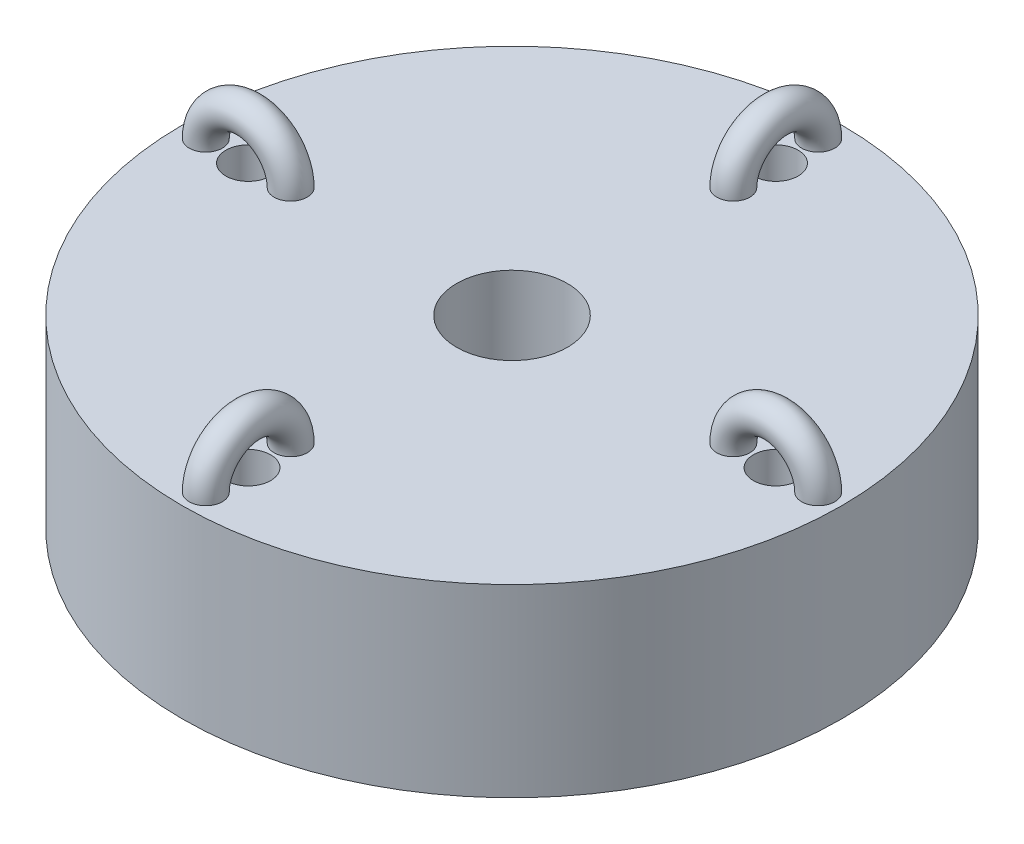
ISO-10303-21;
HEADER;
FILE_DESCRIPTION(('STEP AP214'),'2;1');
FILE_NAME('part.step','',(''),(''),'','','');
FILE_SCHEMA(('AUTOMOTIVE_DESIGN { 1 0 10303 214 1 1 1 1 }'));
ENDSEC;
DATA;
#1=APPLICATION_CONTEXT('core data for automotive mechanical design processes');
#2=APPLICATION_PROTOCOL_DEFINITION('international standard','automotive_design',2000,#1);
#3=PRODUCT_CONTEXT('',#1,'mechanical');
#4=PRODUCT('Part','Part','',(#3));
#5=PRODUCT_RELATED_PRODUCT_CATEGORY('part','',(#4));
#6=PRODUCT_DEFINITION_FORMATION('','',#4);
#7=PRODUCT_DEFINITION_CONTEXT('part definition',#1,'design');
#8=PRODUCT_DEFINITION('design','',#6,#7);
#9=PRODUCT_DEFINITION_SHAPE('','',#8);
#10=(LENGTH_UNIT() NAMED_UNIT(*) SI_UNIT(.MILLI.,.METRE.));
#11=(NAMED_UNIT(*) PLANE_ANGLE_UNIT() SI_UNIT($,.RADIAN.));
#12=(NAMED_UNIT(*) SI_UNIT($,.STERADIAN.) SOLID_ANGLE_UNIT());
#13=UNCERTAINTY_MEASURE_WITH_UNIT(LENGTH_MEASURE(1.E-05),#10,'distance_accuracy_value','');
#14=(GEOMETRIC_REPRESENTATION_CONTEXT(3) GLOBAL_UNCERTAINTY_ASSIGNED_CONTEXT((#13)) GLOBAL_UNIT_ASSIGNED_CONTEXT((#10,
#11,#12)) REPRESENTATION_CONTEXT('',''));
#15=CARTESIAN_POINT('',(0.,0.,0.));
#16=DIRECTION('',(0.,0.,1.));
#17=DIRECTION('',(1.,0.,0.));
#18=AXIS2_PLACEMENT_3D('',#15,#16,#17);
#19=CARTESIAN_POINT('',(0.,7.,0.));
#20=DIRECTION('',(0.,-1.,0.));
#21=DIRECTION('',(0.,0.,-1.));
#22=AXIS2_PLACEMENT_3D('',#19,#20,#21);
#23=CYLINDRICAL_SURFACE('',#22,1.);
#24=CARTESIAN_POINT('',(0.,0.,0.));
#25=DIRECTION('',(0.,1.,0.));
#26=DIRECTION('',(0.,0.,1.));
#27=AXIS2_PLACEMENT_3D('',#24,#25,#26);
#28=CIRCLE('',#27,1.);
#29=CARTESIAN_POINT('',(0.,0.,1.));
#30=VERTEX_POINT('',#29);
#31=EDGE_CURVE('E73',#30,#30,#28,.T.);
#32=ORIENTED_EDGE('',*,*,#31,.F.);
#33=EDGE_LOOP('',(#32));
#34=FACE_BOUND('',#33,.T.);
#35=CARTESIAN_POINT('',(0.,3.,0.));
#36=DIRECTION('',(0.,1.,0.));
#37=DIRECTION('',(0.,0.,1.));
#38=AXIS2_PLACEMENT_3D('',#35,#36,#37);
#39=CIRCLE('',#38,1.);
#40=CARTESIAN_POINT('',(0.,3.,1.));
#41=VERTEX_POINT('',#40);
#42=EDGE_CURVE('E41',#41,#41,#39,.T.);
#43=ORIENTED_EDGE('',*,*,#42,.T.);
#44=EDGE_LOOP('',(#43));
#45=FACE_BOUND('',#44,.T.);
#46=ADVANCED_FACE('F37',(#34,#45),#23,.F.);
#47=CARTESIAN_POINT('',(0.,7.,0.));
#48=DIRECTION('',(0.,1.,0.));
#49=DIRECTION('',(0.,0.,1.));
#50=AXIS2_PLACEMENT_3D('',#47,#48,#49);
#51=PLANE('',#50);
#52=CARTESIAN_POINT('',(0.,7.,0.));
#53=DIRECTION('',(0.,1.,0.));
#54=DIRECTION('',(0.,0.,1.));
#55=AXIS2_PLACEMENT_3D('',#52,#53,#54);
#56=CIRCLE('',#55,2.1);
#57=CARTESIAN_POINT('',(0.,7.,2.1));
#58=VERTEX_POINT('',#57);
#59=EDGE_CURVE('E102',#58,#58,#56,.T.);
#60=ORIENTED_EDGE('',*,*,#59,.F.);
#61=EDGE_LOOP('',(#60));
#62=FACE_BOUND('',#61,.T.);
#63=CARTESIAN_POINT('',(-1.21599318248256E-13,7.,11.6091429823258));
#64=DIRECTION('',(0.,1.,0.));
#65=DIRECTION('',(0.,0.,1.));
#66=AXIS2_PLACEMENT_3D('',#63,#64,#65);
#67=CIRCLE('',#66,0.629258672823457);
#68=CARTESIAN_POINT('',(-1.28190452988661E-13,7.,12.2384016551492));
#69=VERTEX_POINT('',#68);
#70=EDGE_CURVE('E10',#69,#69,#67,.T.);
#71=ORIENTED_EDGE('',*,*,#70,.F.);
#72=EDGE_LOOP('',(#71));
#73=FACE_BOUND('',#72,.T.);
#74=CARTESIAN_POINT('',(0.,7.,8.39085701767423));
#75=DIRECTION('',(0.,1.,0.));
#76=DIRECTION('',(0.,0.,1.));
#77=AXIS2_PLACEMENT_3D('',#74,#75,#76);
#78=CIRCLE('',#77,0.629258672823457);
#79=CARTESIAN_POINT('',(0.,7.,7.76159834485077));
#80=VERTEX_POINT('',#79);
#81=EDGE_CURVE('E45',#80,#80,#78,.T.);
#82=ORIENTED_EDGE('',*,*,#81,.F.);
#83=EDGE_LOOP('',(#82));
#84=FACE_BOUND('',#83,.T.);
#85=CARTESIAN_POINT('',(11.6091429823258,7.,0.));
#86=DIRECTION('',(0.,1.,0.));
#87=DIRECTION('',(0.,0.,1.));
#88=AXIS2_PLACEMENT_3D('',#85,#86,#87);
#89=CIRCLE('',#88,0.629258672823457);
#90=CARTESIAN_POINT('',(12.2384016551492,7.,0.));
#91=VERTEX_POINT('',#90);
#92=EDGE_CURVE('E49',#91,#91,#89,.T.);
#93=ORIENTED_EDGE('',*,*,#92,.F.);
#94=EDGE_LOOP('',(#93));
#95=FACE_BOUND('',#94,.T.);
#96=CARTESIAN_POINT('',(8.39085701767423,7.,0.));
#97=DIRECTION('',(0.,1.,0.));
#98=DIRECTION('',(0.,0.,1.));
#99=AXIS2_PLACEMENT_3D('',#96,#97,#98);
#100=CIRCLE('',#99,0.629258672823457);
#101=CARTESIAN_POINT('',(7.76159834485077,7.,0.));
#102=VERTEX_POINT('',#101);
#103=EDGE_CURVE('E54',#102,#102,#100,.T.);
#104=ORIENTED_EDGE('',*,*,#103,.F.);
#105=EDGE_LOOP('',(#104));
#106=FACE_BOUND('',#105,.T.);
#107=CARTESIAN_POINT('',(0.,7.,-11.6091429823258));
#108=DIRECTION('',(0.,1.,0.));
#109=DIRECTION('',(0.,0.,1.));
#110=AXIS2_PLACEMENT_3D('',#107,#108,#109);
#111=CIRCLE('',#110,0.629258672823457);
#112=CARTESIAN_POINT('',(0.,7.,-12.2384016551492));
#113=VERTEX_POINT('',#112);
#114=EDGE_CURVE('E57',#113,#113,#111,.T.);
#115=ORIENTED_EDGE('',*,*,#114,.F.);
#116=EDGE_LOOP('',(#115));
#117=FACE_BOUND('',#116,.T.);
#118=CARTESIAN_POINT('',(0.,7.,-8.39085701767423));
#119=DIRECTION('',(0.,1.,0.));
#120=DIRECTION('',(0.,0.,1.));
#121=AXIS2_PLACEMENT_3D('',#118,#119,#120);
#122=CIRCLE('',#121,0.629258672823457);
#123=CARTESIAN_POINT('',(0.,7.,-7.76159834485077));
#124=VERTEX_POINT('',#123);
#125=EDGE_CURVE('E60',#124,#124,#122,.T.);
#126=ORIENTED_EDGE('',*,*,#125,.F.);
#127=EDGE_LOOP('',(#126));
#128=FACE_BOUND('',#127,.T.);
#129=CARTESIAN_POINT('',(-11.6091429823258,7.,0.));
#130=DIRECTION('',(0.,1.,0.));
#131=DIRECTION('',(0.,0.,1.));
#132=AXIS2_PLACEMENT_3D('',#129,#130,#131);
#133=CIRCLE('',#132,0.629258672823457);
#134=CARTESIAN_POINT('',(-12.2384016551492,7.,0.));
#135=VERTEX_POINT('',#134);
#136=EDGE_CURVE('E63',#135,#135,#133,.T.);
#137=ORIENTED_EDGE('',*,*,#136,.F.);
#138=EDGE_LOOP('',(#137));
#139=FACE_BOUND('',#138,.T.);
#140=CARTESIAN_POINT('',(-8.39085701767423,7.,0.));
#141=DIRECTION('',(0.,1.,0.));
#142=DIRECTION('',(0.,0.,1.));
#143=AXIS2_PLACEMENT_3D('',#140,#141,#142);
#144=CIRCLE('',#143,0.629258672823457);
#145=CARTESIAN_POINT('',(-7.76159834485077,7.,0.));
#146=VERTEX_POINT('',#145);
#147=EDGE_CURVE('E66',#146,#146,#144,.T.);
#148=ORIENTED_EDGE('',*,*,#147,.F.);
#149=EDGE_LOOP('',(#148));
#150=FACE_BOUND('',#149,.T.);
#151=CARTESIAN_POINT('',(0.,7.,10.));
#152=DIRECTION('',(0.,1.,0.));
#153=DIRECTION('',(0.,0.,1.));
#154=AXIS2_PLACEMENT_3D('',#151,#152,#153);
#155=CIRCLE('',#154,0.85);
#156=CARTESIAN_POINT('',(0.,7.,10.85));
#157=VERTEX_POINT('',#156);
#158=EDGE_CURVE('E88',#157,#157,#155,.T.);
#159=ORIENTED_EDGE('',*,*,#158,.F.);
#160=EDGE_LOOP('',(#159));
#161=FACE_BOUND('',#160,.T.);
#162=CARTESIAN_POINT('',(0.,7.,-10.));
#163=DIRECTION('',(0.,1.,0.));
#164=DIRECTION('',(0.,0.,1.));
#165=AXIS2_PLACEMENT_3D('',#162,#163,#164);
#166=CIRCLE('',#165,0.85);
#167=CARTESIAN_POINT('',(0.,7.,-9.15));
#168=VERTEX_POINT('',#167);
#169=EDGE_CURVE('E78',#168,#168,#166,.T.);
#170=ORIENTED_EDGE('',*,*,#169,.F.);
#171=EDGE_LOOP('',(#170));
#172=FACE_BOUND('',#171,.T.);
#173=CARTESIAN_POINT('',(0.,7.,0.));
#174=DIRECTION('',(0.,1.,0.));
#175=DIRECTION('',(0.,0.,1.));
#176=AXIS2_PLACEMENT_3D('',#173,#174,#175);
#177=CIRCLE('',#176,12.5);
#178=CARTESIAN_POINT('',(0.,7.,12.5));
#179=VERTEX_POINT('',#178);
#180=EDGE_CURVE('E69',#179,#179,#177,.T.);
#181=ORIENTED_EDGE('',*,*,#180,.T.);
#182=EDGE_LOOP('',(#181));
#183=FACE_BOUND('',#182,.T.);
#184=CARTESIAN_POINT('',(10.,7.,0.));
#185=DIRECTION('',(0.,1.,0.));
#186=DIRECTION('',(0.,0.,1.));
#187=AXIS2_PLACEMENT_3D('',#184,#185,#186);
#188=CIRCLE('',#187,0.85);
#189=CARTESIAN_POINT('',(10.,7.,0.849999999999999));
#190=VERTEX_POINT('',#189);
#191=EDGE_CURVE('E82',#190,#190,#188,.T.);
#192=ORIENTED_EDGE('',*,*,#191,.F.);
#193=EDGE_LOOP('',(#192));
#194=FACE_BOUND('',#193,.T.);
#195=CARTESIAN_POINT('',(-10.,7.,0.));
#196=DIRECTION('',(0.,1.,0.));
#197=DIRECTION('',(0.,0.,1.));
#198=AXIS2_PLACEMENT_3D('',#195,#196,#197);
#199=CIRCLE('',#198,0.85);
#200=CARTESIAN_POINT('',(-10.,7.,0.850000000000002));
#201=VERTEX_POINT('',#200);
#202=EDGE_CURVE('E94',#201,#201,#199,.T.);
#203=ORIENTED_EDGE('',*,*,#202,.F.);
#204=EDGE_LOOP('',(#203));
#205=FACE_BOUND('',#204,.T.);
#206=ADVANCED_FACE('F124',(#62,#73,#84,#95,#106,#117,#128,#139,#150,#161,#172,#183,#194,#205),
#51,.T.);
#207=CARTESIAN_POINT('',(0.,0.,0.));
#208=DIRECTION('',(0.,1.,0.));
#209=DIRECTION('',(0.,0.,1.));
#210=AXIS2_PLACEMENT_3D('',#207,#208,#209);
#211=PLANE('',#210);
#212=CARTESIAN_POINT('',(0.,0.,0.));
#213=DIRECTION('',(0.,1.,0.));
#214=DIRECTION('',(0.,0.,1.));
#215=AXIS2_PLACEMENT_3D('',#212,#213,#214);
#216=CIRCLE('',#215,12.5);
#217=CARTESIAN_POINT('',(0.,0.,12.5));
#218=VERTEX_POINT('',#217);
#219=EDGE_CURVE('E70',#218,#218,#216,.T.);
#220=ORIENTED_EDGE('',*,*,#219,.F.);
#221=EDGE_LOOP('',(#220));
#222=FACE_BOUND('',#221,.T.);
#223=ORIENTED_EDGE('',*,*,#31,.T.);
#224=EDGE_LOOP('',(#223));
#225=FACE_BOUND('',#224,.T.);
#226=CARTESIAN_POINT('',(0.,0.,-10.));
#227=DIRECTION('',(0.,1.,0.));
#228=DIRECTION('',(0.,0.,1.));
#229=AXIS2_PLACEMENT_3D('',#226,#227,#228);
#230=CIRCLE('',#229,0.85);
#231=CARTESIAN_POINT('',(0.,0.,-9.15));
#232=VERTEX_POINT('',#231);
#233=EDGE_CURVE('E79',#232,#232,#230,.T.);
#234=ORIENTED_EDGE('',*,*,#233,.T.);
#235=EDGE_LOOP('',(#234));
#236=FACE_BOUND('',#235,.T.);
#237=CARTESIAN_POINT('',(10.,0.,0.));
#238=DIRECTION('',(0.,1.,0.));
#239=DIRECTION('',(0.,0.,1.));
#240=AXIS2_PLACEMENT_3D('',#237,#238,#239);
#241=CIRCLE('',#240,0.85);
#242=CARTESIAN_POINT('',(10.,0.,0.849999999999999));
#243=VERTEX_POINT('',#242);
#244=EDGE_CURVE('E85',#243,#243,#241,.T.);
#245=ORIENTED_EDGE('',*,*,#244,.T.);
#246=EDGE_LOOP('',(#245));
#247=FACE_BOUND('',#246,.T.);
#248=CARTESIAN_POINT('',(0.,0.,10.));
#249=DIRECTION('',(0.,1.,0.));
#250=DIRECTION('',(0.,0.,1.));
#251=AXIS2_PLACEMENT_3D('',#248,#249,#250);
#252=CIRCLE('',#251,0.85);
#253=CARTESIAN_POINT('',(0.,0.,10.85));
#254=VERTEX_POINT('',#253);
#255=EDGE_CURVE('E91',#254,#254,#252,.T.);
#256=ORIENTED_EDGE('',*,*,#255,.T.);
#257=EDGE_LOOP('',(#256));
#258=FACE_BOUND('',#257,.T.);
#259=CARTESIAN_POINT('',(-10.,0.,0.));
#260=DIRECTION('',(0.,1.,0.));
#261=DIRECTION('',(0.,0.,1.));
#262=AXIS2_PLACEMENT_3D('',#259,#260,#261);
#263=CIRCLE('',#262,0.85);
#264=CARTESIAN_POINT('',(-10.,0.,0.850000000000002));
#265=VERTEX_POINT('',#264);
#266=EDGE_CURVE('E97',#265,#265,#263,.T.);
#267=ORIENTED_EDGE('',*,*,#266,.T.);
#268=EDGE_LOOP('',(#267));
#269=FACE_BOUND('',#268,.T.);
#270=ADVANCED_FACE('F130',(#222,#225,#236,#247,#258,#269),#211,.F.);
#271=CARTESIAN_POINT('',(0.,7.,0.));
#272=DIRECTION('',(0.,-1.,0.));
#273=DIRECTION('',(0.,0.,-1.));
#274=AXIS2_PLACEMENT_3D('',#271,#272,#273);
#275=CYLINDRICAL_SURFACE('',#274,12.5);
#276=ORIENTED_EDGE('',*,*,#180,.F.);
#277=EDGE_LOOP('',(#276));
#278=FACE_BOUND('',#277,.T.);
#279=ORIENTED_EDGE('',*,*,#219,.T.);
#280=EDGE_LOOP('',(#279));
#281=FACE_BOUND('',#280,.T.);
#282=ADVANCED_FACE('F39',(#278,#281),#275,.T.);
#283=CARTESIAN_POINT('',(0.,7.,-10.));
#284=DIRECTION('',(0.,-1.,0.));
#285=DIRECTION('',(0.,0.,-1.));
#286=AXIS2_PLACEMENT_3D('',#283,#284,#285);
#287=CYLINDRICAL_SURFACE('',#286,0.85);
#288=ORIENTED_EDGE('',*,*,#169,.T.);
#289=EDGE_LOOP('',(#288));
#290=FACE_BOUND('',#289,.T.);
#291=ORIENTED_EDGE('',*,*,#233,.F.);
#292=EDGE_LOOP('',(#291));
#293=FACE_BOUND('',#292,.T.);
#294=ADVANCED_FACE('F135',(#290,#293),#287,.F.);
#295=CARTESIAN_POINT('',(10.,7.,0.));
#296=DIRECTION('',(0.,-1.,0.));
#297=DIRECTION('',(0.,0.,-1.));
#298=AXIS2_PLACEMENT_3D('',#295,#296,#297);
#299=CYLINDRICAL_SURFACE('',#298,0.85);
#300=ORIENTED_EDGE('',*,*,#191,.T.);
#301=EDGE_LOOP('',(#300));
#302=FACE_BOUND('',#301,.T.);
#303=ORIENTED_EDGE('',*,*,#244,.F.);
#304=EDGE_LOOP('',(#303));
#305=FACE_BOUND('',#304,.T.);
#306=ADVANCED_FACE('F167',(#302,#305),#299,.F.);
#307=CARTESIAN_POINT('',(0.,7.,10.));
#308=DIRECTION('',(0.,-1.,0.));
#309=DIRECTION('',(0.,0.,-1.));
#310=AXIS2_PLACEMENT_3D('',#307,#308,#309);
#311=CYLINDRICAL_SURFACE('',#310,0.85);
#312=ORIENTED_EDGE('',*,*,#158,.T.);
#313=EDGE_LOOP('',(#312));
#314=FACE_BOUND('',#313,.T.);
#315=ORIENTED_EDGE('',*,*,#255,.F.);
#316=EDGE_LOOP('',(#315));
#317=FACE_BOUND('',#316,.T.);
#318=ADVANCED_FACE('F157',(#314,#317),#311,.F.);
#319=CARTESIAN_POINT('',(-10.,7.,0.));
#320=DIRECTION('',(0.,-1.,0.));
#321=DIRECTION('',(0.,0.,-1.));
#322=AXIS2_PLACEMENT_3D('',#319,#320,#321);
#323=CYLINDRICAL_SURFACE('',#322,0.85);
#324=ORIENTED_EDGE('',*,*,#202,.T.);
#325=EDGE_LOOP('',(#324));
#326=FACE_BOUND('',#325,.T.);
#327=ORIENTED_EDGE('',*,*,#266,.F.);
#328=EDGE_LOOP('',(#327));
#329=FACE_BOUND('',#328,.T.);
#330=ADVANCED_FACE('F154',(#326,#329),#323,.F.);
#331=CARTESIAN_POINT('',(-10.,7.,0.));
#332=DIRECTION('',(0.,0.,1.));
#333=DIRECTION('',(1.,0.,0.));
#334=AXIS2_PLACEMENT_3D('',#331,#332,#333);
#335=TOROIDAL_SURFACE('',#334,1.60914298232577,0.629258672823457);
#336=CARTESIAN_POINT('',(-10.,7.,0.));
#337=DIRECTION('',(0.,0.,1.));
#338=DIRECTION('',(1.,0.,0.));
#339=AXIS2_PLACEMENT_3D('',#336,#337,#338);
#340=CIRCLE('',#339,2.23840165514923);
#341=EDGE_CURVE('',#146,#135,#340,.T.);
#342=ORIENTED_EDGE('',*,*,#147,.T.);
#343=ORIENTED_EDGE('',*,*,#136,.T.);
#344=ORIENTED_EDGE('',*,*,#341,.T.);
#345=ORIENTED_EDGE('',*,*,#341,.F.);
#346=EDGE_LOOP('',(#342,#344,#343,#345));
#347=FACE_BOUND('',#346,.T.);
#348=ADVANCED_FACE('F156',(#347),#335,.T.);
#349=CARTESIAN_POINT('',(0.,7.,-10.));
#350=DIRECTION('',(-1.,0.,0.));
#351=DIRECTION('',(0.,0.,1.));
#352=AXIS2_PLACEMENT_3D('',#349,#350,#351);
#353=TOROIDAL_SURFACE('',#352,1.60914298232577,0.629258672823457);
#354=CARTESIAN_POINT('',(0.,7.,-10.));
#355=DIRECTION('',(-1.,0.,0.));
#356=DIRECTION('',(0.,0.,1.));
#357=AXIS2_PLACEMENT_3D('',#354,#355,#356);
#358=CIRCLE('',#357,2.23840165514923);
#359=EDGE_CURVE('',#124,#113,#358,.T.);
#360=ORIENTED_EDGE('',*,*,#125,.T.);
#361=ORIENTED_EDGE('',*,*,#114,.T.);
#362=ORIENTED_EDGE('',*,*,#359,.T.);
#363=ORIENTED_EDGE('',*,*,#359,.F.);
#364=EDGE_LOOP('',(#360,#362,#361,#363));
#365=FACE_BOUND('',#364,.T.);
#366=ADVANCED_FACE('F164',(#365),#353,.T.);
#367=CARTESIAN_POINT('',(10.,7.,0.));
#368=DIRECTION('',(0.,0.,-1.));
#369=DIRECTION('',(-1.,0.,0.));
#370=AXIS2_PLACEMENT_3D('',#367,#368,#369);
#371=TOROIDAL_SURFACE('',#370,1.60914298232577,0.629258672823457);
#372=CARTESIAN_POINT('',(10.,7.,0.));
#373=DIRECTION('',(0.,0.,-1.));
#374=DIRECTION('',(-1.,0.,0.));
#375=AXIS2_PLACEMENT_3D('',#372,#373,#374);
#376=CIRCLE('',#375,2.23840165514923);
#377=EDGE_CURVE('',#102,#91,#376,.T.);
#378=ORIENTED_EDGE('',*,*,#103,.T.);
#379=ORIENTED_EDGE('',*,*,#92,.T.);
#380=ORIENTED_EDGE('',*,*,#377,.T.);
#381=ORIENTED_EDGE('',*,*,#377,.F.);
#382=EDGE_LOOP('',(#378,#380,#379,#381));
#383=FACE_BOUND('',#382,.T.);
#384=ADVANCED_FACE('F224',(#383),#371,.T.);
#385=CARTESIAN_POINT('',(-1.04744440165294E-13,7.,10.));
#386=DIRECTION('',(1.,0.,0.));
#387=DIRECTION('',(0.,0.,-1.));
#388=AXIS2_PLACEMENT_3D('',#385,#386,#387);
#389=TOROIDAL_SURFACE('',#388,1.60914298232577,0.629258672823457);
#390=CARTESIAN_POINT('',(-1.04744440165294E-13,7.,10.));
#391=DIRECTION('',(1.,0.,0.));
#392=DIRECTION('',(0.,0.,-1.));
#393=AXIS2_PLACEMENT_3D('',#390,#391,#392);
#394=CIRCLE('',#393,2.23840165514923);
#395=EDGE_CURVE('',#80,#69,#394,.T.);
#396=ORIENTED_EDGE('',*,*,#81,.T.);
#397=ORIENTED_EDGE('',*,*,#70,.T.);
#398=ORIENTED_EDGE('',*,*,#395,.T.);
#399=ORIENTED_EDGE('',*,*,#395,.F.);
#400=EDGE_LOOP('',(#396,#398,#397,#399));
#401=FACE_BOUND('',#400,.T.);
#402=ADVANCED_FACE('F120',(#401),#389,.T.);
#403=CARTESIAN_POINT('',(0.,3.,0.));
#404=DIRECTION('',(0.,1.,0.));
#405=DIRECTION('',(0.,0.,1.));
#406=AXIS2_PLACEMENT_3D('',#403,#404,#405);
#407=CYLINDRICAL_SURFACE('',#406,2.1);
#408=CARTESIAN_POINT('',(0.,3.,0.));
#409=DIRECTION('',(0.,1.,0.));
#410=DIRECTION('',(0.,0.,1.));
#411=AXIS2_PLACEMENT_3D('',#408,#409,#410);
#412=CIRCLE('',#411,2.1);
#413=CARTESIAN_POINT('',(0.,3.,2.1));
#414=VERTEX_POINT('',#413);
#415=EDGE_CURVE('E105',#414,#414,#412,.T.);
#416=ORIENTED_EDGE('',*,*,#415,.F.);
#417=EDGE_LOOP('',(#416));
#418=FACE_BOUND('',#417,.T.);
#419=ORIENTED_EDGE('',*,*,#59,.T.);
#420=EDGE_LOOP('',(#419));
#421=FACE_BOUND('',#420,.T.);
#422=ADVANCED_FACE('F115',(#418,#421),#407,.F.);
#423=CARTESIAN_POINT('',(0.,3.,0.));
#424=DIRECTION('',(0.,1.,0.));
#425=DIRECTION('',(0.,0.,1.));
#426=AXIS2_PLACEMENT_3D('',#423,#424,#425);
#427=PLANE('',#426);
#428=ORIENTED_EDGE('',*,*,#42,.F.);
#429=EDGE_LOOP('',(#428));
#430=FACE_BOUND('',#429,.T.);
#431=ORIENTED_EDGE('',*,*,#415,.T.);
#432=EDGE_LOOP('',(#431));
#433=FACE_BOUND('',#432,.T.);
#434=ADVANCED_FACE('F113',(#430,#433),#427,.T.);
#435=CLOSED_SHELL('',(#46,#206,#270,#282,#294,#306,#318,#330,#348,#366,#384,#402,#422,#434));
#436=MANIFOLD_SOLID_BREP('B2',#435);
#437=ADVANCED_BREP_SHAPE_REPRESENTATION('',(#18,#436),#14);
#438=SHAPE_DEFINITION_REPRESENTATION(#9,#437);
ENDSEC;
END-ISO-10303-21;
